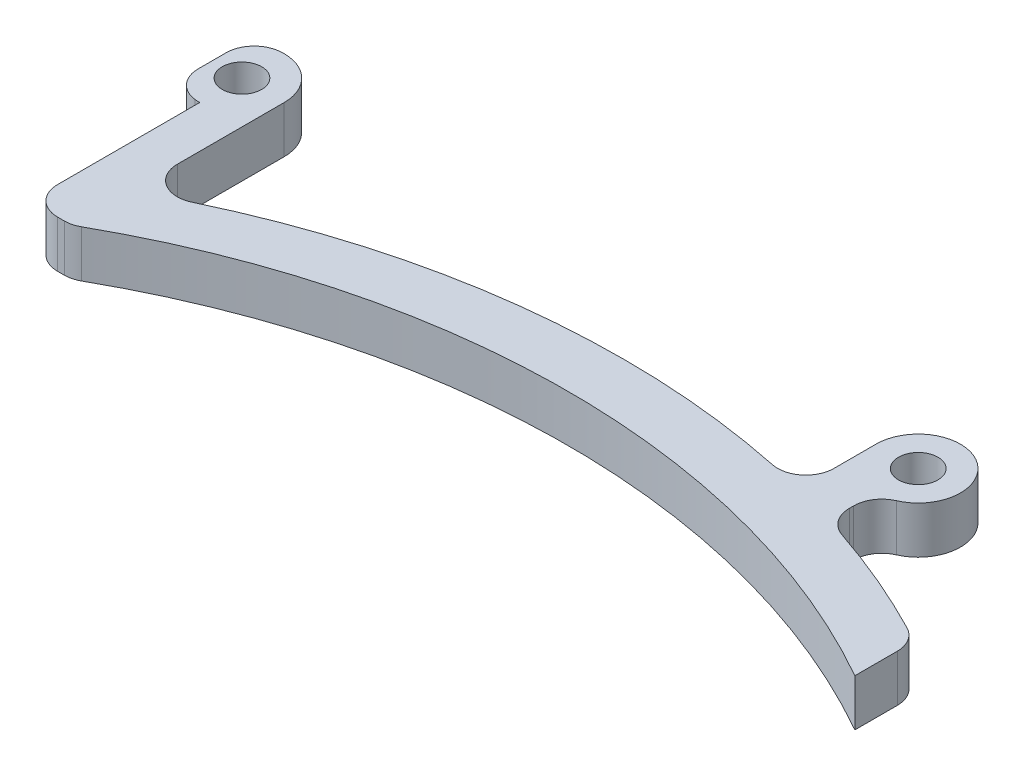
ISO-10303-21;
HEADER;
FILE_DESCRIPTION(('STEP AP214'),'2;1');
FILE_NAME('part.step','',(''),(''),'','','');
FILE_SCHEMA(('AUTOMOTIVE_DESIGN { 1 0 10303 214 1 1 1 1 }'));
ENDSEC;
DATA;
#1=APPLICATION_CONTEXT('core data for automotive mechanical design processes');
#2=APPLICATION_PROTOCOL_DEFINITION('international standard','automotive_design',2000,#1);
#3=PRODUCT_CONTEXT('',#1,'mechanical');
#4=PRODUCT('Part','Part','',(#3));
#5=PRODUCT_RELATED_PRODUCT_CATEGORY('part','',(#4));
#6=PRODUCT_DEFINITION_FORMATION('','',#4);
#7=PRODUCT_DEFINITION_CONTEXT('part definition',#1,'design');
#8=PRODUCT_DEFINITION('design','',#6,#7);
#9=PRODUCT_DEFINITION_SHAPE('','',#8);
#10=(LENGTH_UNIT() NAMED_UNIT(*) SI_UNIT(.MILLI.,.METRE.));
#11=(NAMED_UNIT(*) PLANE_ANGLE_UNIT() SI_UNIT($,.RADIAN.));
#12=(NAMED_UNIT(*) SI_UNIT($,.STERADIAN.) SOLID_ANGLE_UNIT());
#13=UNCERTAINTY_MEASURE_WITH_UNIT(LENGTH_MEASURE(1.E-05),#10,'distance_accuracy_value','');
#14=(GEOMETRIC_REPRESENTATION_CONTEXT(3) GLOBAL_UNCERTAINTY_ASSIGNED_CONTEXT((#13)) GLOBAL_UNIT_ASSIGNED_CONTEXT((#10,
#11,#12)) REPRESENTATION_CONTEXT('',''));
#15=CARTESIAN_POINT('',(0.,0.,0.));
#16=DIRECTION('',(0.,0.,1.));
#17=DIRECTION('',(1.,0.,0.));
#18=AXIS2_PLACEMENT_3D('',#15,#16,#17);
#19=CARTESIAN_POINT('',(0.,5.,0.));
#20=DIRECTION('',(0.,1.,0.));
#21=DIRECTION('',(0.,0.,1.));
#22=AXIS2_PLACEMENT_3D('',#19,#20,#21);
#23=PLANE('',#22);
#24=CARTESIAN_POINT('',(0.,5.,0.));
#25=DIRECTION('',(0.,1.,0.));
#26=DIRECTION('',(0.,0.,1.));
#27=AXIS2_PLACEMENT_3D('',#24,#25,#26);
#28=CIRCLE('',#27,2.1);
#29=CARTESIAN_POINT('',(0.,5.,2.1));
#30=VERTEX_POINT('',#29);
#31=EDGE_CURVE('E323',#30,#30,#28,.T.);
#32=ORIENTED_EDGE('',*,*,#31,.F.);
#33=EDGE_LOOP('',(#32));
#34=FACE_BOUND('',#33,.T.);
#35=CARTESIAN_POINT('',(0.,5.,0.));
#36=DIRECTION('',(0.,1.,0.));
#37=DIRECTION('',(0.,0.,1.));
#38=AXIS2_PLACEMENT_3D('',#35,#36,#37);
#39=CIRCLE('',#38,4.5);
#40=CARTESIAN_POINT('',(4.5,5.,0.));
#41=VERTEX_POINT('',#40);
#42=CARTESIAN_POINT('',(-0.54594154601839,5.,-4.46676032806004));
#43=VERTEX_POINT('',#42);
#44=EDGE_CURVE('E311',#41,#43,#39,.T.);
#45=ORIENTED_EDGE('',*,*,#44,.T.);
#46=CARTESIAN_POINT('',(-0.181980515339463,5.,-1.48892010935335));
#47=DIRECTION('',(0.,1.,0.));
#48=DIRECTION('',(0.,0.,1.));
#49=AXIS2_PLACEMENT_3D('',#46,#47,#48);
#50=CIRCLE('',#49,3.);
#51=CARTESIAN_POINT('',(-3.18198051533946,5.,-1.48892010935335));
#52=VERTEX_POINT('',#51);
#53=EDGE_CURVE('E240',#43,#52,#50,.T.);
#54=ORIENTED_EDGE('',*,*,#53,.T.);
#55=DIRECTION('',(0.,0.,1.));
#56=VECTOR('',#55,1.);
#57=CARTESIAN_POINT('',(-3.18198051533946,5.,3.18198051533946));
#58=LINE('',#57,#56);
#59=CARTESIAN_POINT('',(-3.18198051533946,5.,1.48892010935335));
#60=VERTEX_POINT('',#59);
#61=EDGE_CURVE('E314',#52,#60,#58,.T.);
#62=ORIENTED_EDGE('',*,*,#61,.T.);
#63=CARTESIAN_POINT('',(-0.181980515339463,5.,1.48892010935335));
#64=DIRECTION('',(0.,1.,0.));
#65=DIRECTION('',(0.,0.,1.));
#66=AXIS2_PLACEMENT_3D('',#63,#64,#65);
#67=CIRCLE('',#66,3.);
#68=CARTESIAN_POINT('',(-0.54594154601839,5.,4.46676032806004));
#69=VERTEX_POINT('',#68);
#70=EDGE_CURVE('E189',#60,#69,#67,.T.);
#71=ORIENTED_EDGE('',*,*,#70,.T.);
#72=CARTESIAN_POINT('',(0.,5.,0.));
#73=DIRECTION('',(0.,1.,0.));
#74=DIRECTION('',(0.,0.,1.));
#75=AXIS2_PLACEMENT_3D('',#72,#73,#74);
#76=CIRCLE('',#75,4.5);
#77=CARTESIAN_POINT('',(0.,5.,4.5));
#78=VERTEX_POINT('',#77);
#79=EDGE_CURVE('E181',#69,#78,#76,.T.);
#80=ORIENTED_EDGE('',*,*,#79,.T.);
#81=DIRECTION('',(0.,0.,1.));
#82=VECTOR('',#81,1.);
#83=CARTESIAN_POINT('',(0.,5.,22.6291091194863));
#84=LINE('',#83,#82);
#85=CARTESIAN_POINT('',(0.,5.,19.6291091194863));
#86=VERTEX_POINT('',#85);
#87=EDGE_CURVE('E185',#78,#86,#84,.T.);
#88=ORIENTED_EDGE('',*,*,#87,.T.);
#89=CARTESIAN_POINT('',(3.,5.,19.6291091194863));
#90=DIRECTION('',(0.,1.,0.));
#91=DIRECTION('',(0.,0.,1.));
#92=AXIS2_PLACEMENT_3D('',#89,#90,#91);
#93=CIRCLE('',#92,3.);
#94=CARTESIAN_POINT('',(3.,5.,22.6291091194863));
#95=VERTEX_POINT('',#94);
#96=EDGE_CURVE('E236',#86,#95,#93,.T.);
#97=ORIENTED_EDGE('',*,*,#96,.T.);
#98=DIRECTION('',(1.,0.,0.));
#99=VECTOR('',#98,1.);
#100=CARTESIAN_POINT('',(0.,5.,22.6291091194863));
#101=LINE('',#100,#99);
#102=CARTESIAN_POINT('',(3.70915142787574,5.,22.6291091194863));
#103=VERTEX_POINT('',#102);
#104=EDGE_CURVE('E203',#95,#103,#101,.T.);
#105=ORIENTED_EDGE('',*,*,#104,.T.);
#106=CARTESIAN_POINT('',(3.70915142787574,5.,19.6291091194863));
#107=DIRECTION('',(0.,1.,0.));
#108=DIRECTION('',(0.,0.,1.));
#109=AXIS2_PLACEMENT_3D('',#106,#107,#108);
#110=CIRCLE('',#109,3.);
#111=CARTESIAN_POINT('',(5.17609007882601,5.,22.2459948629509));
#112=VERTEX_POINT('',#111);
#113=EDGE_CURVE('E234',#103,#112,#110,.T.);
#114=ORIENTED_EDGE('',*,*,#113,.T.);
#115=CARTESIAN_POINT('',(46.25,5.,95.5181315207732));
#116=DIRECTION('',(0.,-1.,0.));
#117=DIRECTION('',(0.,0.,-1.));
#118=AXIS2_PLACEMENT_3D('',#115,#116,#117);
#119=CIRCLE('',#118,83.9992386073547);
#120=CARTESIAN_POINT('',(87.7275267094584,5.,22.4737144536115));
#121=VERTEX_POINT('',#120);
#122=EDGE_CURVE('E375',#112,#121,#119,.T.);
#123=ORIENTED_EDGE('',*,*,#122,.T.);
#124=DIRECTION('',(0.,0.,-1.));
#125=VECTOR('',#124,1.);
#126=CARTESIAN_POINT('',(87.7275267094584,5.,16.1522505392229));
#127=LINE('',#126,#125);
#128=CARTESIAN_POINT('',(87.7275267094584,5.,17.9560889558364));
#129=VERTEX_POINT('',#128);
#130=EDGE_CURVE('E372',#121,#129,#127,.T.);
#131=ORIENTED_EDGE('',*,*,#130,.T.);
#132=CARTESIAN_POINT('',(84.7275267094584,5.,17.9560889558364));
#133=DIRECTION('',(0.,1.,0.));
#134=DIRECTION('',(0.,0.,1.));
#135=AXIS2_PLACEMENT_3D('',#132,#133,#134);
#136=CIRCLE('',#135,3.);
#137=CARTESIAN_POINT('',(86.1059443856065,5.,15.2915130589848));
#138=VERTEX_POINT('',#137);
#139=EDGE_CURVE('E238',#129,#138,#136,.T.);
#140=ORIENTED_EDGE('',*,*,#139,.T.);
#141=CARTESIAN_POINT('',(46.25,5.,92.3357867895067));
#142=DIRECTION('',(0.,1.,0.));
#143=DIRECTION('',(0.,0.,-1.));
#144=AXIS2_PLACEMENT_3D('',#141,#142,#143);
#145=CIRCLE('',#144,86.7428176711602);
#146=CARTESIAN_POINT('',(74.0389203031708,5.,10.1646706603207));
#147=VERTEX_POINT('',#146);
#148=EDGE_CURVE('E369',#138,#147,#145,.T.);
#149=ORIENTED_EDGE('',*,*,#148,.T.);
#150=CARTESIAN_POINT('',(75.,5.,7.32278293974789));
#151=DIRECTION('',(0.,1.,0.));
#152=DIRECTION('',(0.,0.,1.));
#153=AXIS2_PLACEMENT_3D('',#150,#151,#152);
#154=CIRCLE('',#153,3.);
#155=CARTESIAN_POINT('',(72.,5.,7.32278293974789));
#156=VERTEX_POINT('',#155);
#157=EDGE_CURVE('E287',#147,#156,#154,.F.);
#158=ORIENTED_EDGE('',*,*,#157,.T.);
#159=DIRECTION('',(0.,0.,-1.));
#160=VECTOR('',#159,1.);
#161=CARTESIAN_POINT('',(72.,5.,9.50310050243676));
#162=LINE('',#161,#160);
#163=CARTESIAN_POINT('',(72.,5.,6.87386354243376));
#164=VERTEX_POINT('',#163);
#165=EDGE_CURVE('E364',#156,#164,#162,.T.);
#166=ORIENTED_EDGE('',*,*,#165,.T.);
#167=CARTESIAN_POINT('',(75.,5.,6.87386354243376));
#168=DIRECTION('',(0.,1.,0.));
#169=DIRECTION('',(0.,0.,1.));
#170=AXIS2_PLACEMENT_3D('',#167,#168,#169);
#171=CIRCLE('',#170,3.);
#172=CARTESIAN_POINT('',(73.8,5.,4.12431812546026));
#173=VERTEX_POINT('',#172);
#174=EDGE_CURVE('E283',#164,#173,#171,.F.);
#175=ORIENTED_EDGE('',*,*,#174,.T.);
#176=CARTESIAN_POINT('',(72.,5.,0.));
#177=DIRECTION('',(0.,1.,0.));
#178=DIRECTION('',(0.,0.,1.));
#179=AXIS2_PLACEMENT_3D('',#176,#177,#178);
#180=CIRCLE('',#179,4.5);
#181=CARTESIAN_POINT('',(67.5,5.,0.));
#182=VERTEX_POINT('',#181);
#183=EDGE_CURVE('E363',#173,#182,#180,.T.);
#184=ORIENTED_EDGE('',*,*,#183,.T.);
#185=DIRECTION('',(0.,0.,1.));
#186=VECTOR('',#185,1.);
#187=CARTESIAN_POINT('',(67.5,5.,0.));
#188=LINE('',#187,#186);
#189=CARTESIAN_POINT('',(67.5,5.,4.46821129342791));
#190=VERTEX_POINT('',#189);
#191=EDGE_CURVE('E316',#182,#190,#188,.T.);
#192=ORIENTED_EDGE('',*,*,#191,.T.);
#193=CARTESIAN_POINT('',(64.5,5.,4.46821129342791));
#194=DIRECTION('',(0.,1.,0.));
#195=DIRECTION('',(0.,0.,1.));
#196=AXIS2_PLACEMENT_3D('',#193,#194,#195);
#197=CIRCLE('',#196,3.);
#198=CARTESIAN_POINT('',(63.8899233228823,5.,7.40552408712848));
#199=VERTEX_POINT('',#198);
#200=EDGE_CURVE('E279',#190,#199,#197,.F.);
#201=ORIENTED_EDGE('',*,*,#200,.T.);
#202=CARTESIAN_POINT('',(46.25,5.,92.3357867895067));
#203=DIRECTION('',(0.,1.,0.));
#204=DIRECTION('',(0.,0.,-1.));
#205=AXIS2_PLACEMENT_3D('',#202,#203,#204);
#206=CIRCLE('',#205,86.7428176711602);
#207=CARTESIAN_POINT('',(8.79536828703072,5.,14.0959824647387));
#208=VERTEX_POINT('',#207);
#209=EDGE_CURVE('E312',#199,#208,#206,.T.);
#210=ORIENTED_EDGE('',*,*,#209,.T.);
#211=CARTESIAN_POINT('',(7.5,5.,11.3900591470974));
#212=DIRECTION('',(0.,1.,0.));
#213=DIRECTION('',(0.,0.,1.));
#214=AXIS2_PLACEMENT_3D('',#211,#212,#213);
#215=CIRCLE('',#214,3.);
#216=CARTESIAN_POINT('',(4.5,5.,11.3900591470974));
#217=VERTEX_POINT('',#216);
#218=EDGE_CURVE('E11',#208,#217,#215,.F.);
#219=ORIENTED_EDGE('',*,*,#218,.T.);
#220=DIRECTION('',(0.,0.,-1.));
#221=VECTOR('',#220,1.);
#222=CARTESIAN_POINT('',(4.5,5.,0.));
#223=LINE('',#222,#221);
#224=EDGE_CURVE('E308',#217,#41,#223,.T.);
#225=ORIENTED_EDGE('',*,*,#224,.T.);
#226=EDGE_LOOP('',(#45,#54,#62,#71,#80,#88,#97,#105,#114,#123,#131,#140,#149,#158,#166,#175,
#184,#192,#201,#210,#219,#225));
#227=FACE_BOUND('',#226,.T.);
#228=CARTESIAN_POINT('',(72.,5.,0.));
#229=DIRECTION('',(0.,1.,0.));
#230=DIRECTION('',(0.,0.,1.));
#231=AXIS2_PLACEMENT_3D('',#228,#229,#230);
#232=CIRCLE('',#231,2.1);
#233=CARTESIAN_POINT('',(72.,5.,2.1));
#234=VERTEX_POINT('',#233);
#235=EDGE_CURVE('E382',#234,#234,#232,.T.);
#236=ORIENTED_EDGE('',*,*,#235,.F.);
#237=EDGE_LOOP('',(#236));
#238=FACE_BOUND('',#237,.T.);
#239=ADVANCED_FACE('F33',(#34,#227,#238),#23,.T.);
#240=CARTESIAN_POINT('',(0.,0.,0.));
#241=DIRECTION('',(0.,1.,0.));
#242=DIRECTION('',(0.,0.,1.));
#243=AXIS2_PLACEMENT_3D('',#240,#241,#242);
#244=PLANE('',#243);
#245=DIRECTION('',(0.,0.,1.));
#246=VECTOR('',#245,1.);
#247=CARTESIAN_POINT('',(-3.18198051533946,0.,3.18198051533946));
#248=LINE('',#247,#246);
#249=CARTESIAN_POINT('',(-3.18198051533946,0.,-1.48892010935335));
#250=VERTEX_POINT('',#249);
#251=CARTESIAN_POINT('',(-3.18198051533946,0.,1.48892010935335));
#252=VERTEX_POINT('',#251);
#253=EDGE_CURVE('E194',#250,#252,#248,.T.);
#254=ORIENTED_EDGE('',*,*,#253,.F.);
#255=CARTESIAN_POINT('',(-0.181980515339463,0.,-1.48892010935335));
#256=DIRECTION('',(0.,1.,0.));
#257=DIRECTION('',(0.,0.,1.));
#258=AXIS2_PLACEMENT_3D('',#255,#256,#257);
#259=CIRCLE('',#258,3.);
#260=CARTESIAN_POINT('',(-0.54594154601839,0.,-4.46676032806004));
#261=VERTEX_POINT('',#260);
#262=EDGE_CURVE('E229',#250,#261,#259,.F.);
#263=ORIENTED_EDGE('',*,*,#262,.T.);
#264=CARTESIAN_POINT('',(0.,0.,0.));
#265=DIRECTION('',(0.,1.,0.));
#266=DIRECTION('',(0.,0.,1.));
#267=AXIS2_PLACEMENT_3D('',#264,#265,#266);
#268=CIRCLE('',#267,4.5);
#269=CARTESIAN_POINT('',(4.5,0.,0.));
#270=VERTEX_POINT('',#269);
#271=EDGE_CURVE('E344',#270,#261,#268,.T.);
#272=ORIENTED_EDGE('',*,*,#271,.F.);
#273=DIRECTION('',(0.,0.,-1.));
#274=VECTOR('',#273,1.);
#275=CARTESIAN_POINT('',(4.5,0.,0.));
#276=LINE('',#275,#274);
#277=CARTESIAN_POINT('',(4.5,0.,11.3900591470974));
#278=VERTEX_POINT('',#277);
#279=EDGE_CURVE('E296',#278,#270,#276,.T.);
#280=ORIENTED_EDGE('',*,*,#279,.F.);
#281=CARTESIAN_POINT('',(7.5,0.,11.3900591470974));
#282=DIRECTION('',(0.,1.,0.));
#283=DIRECTION('',(0.,0.,1.));
#284=AXIS2_PLACEMENT_3D('',#281,#282,#283);
#285=CIRCLE('',#284,3.);
#286=CARTESIAN_POINT('',(8.79536828703072,0.,14.0959824647387));
#287=VERTEX_POINT('',#286);
#288=EDGE_CURVE('E41',#278,#287,#285,.T.);
#289=ORIENTED_EDGE('',*,*,#288,.T.);
#290=CARTESIAN_POINT('',(46.25,0.,92.3357867895067));
#291=DIRECTION('',(0.,1.,0.));
#292=DIRECTION('',(0.,0.,-1.));
#293=AXIS2_PLACEMENT_3D('',#290,#291,#292);
#294=CIRCLE('',#293,86.7428176711602);
#295=CARTESIAN_POINT('',(63.8899233228823,0.,7.40552408712848));
#296=VERTEX_POINT('',#295);
#297=EDGE_CURVE('E294',#296,#287,#294,.T.);
#298=ORIENTED_EDGE('',*,*,#297,.F.);
#299=CARTESIAN_POINT('',(64.5,0.,4.46821129342791));
#300=DIRECTION('',(0.,1.,0.));
#301=DIRECTION('',(0.,0.,1.));
#302=AXIS2_PLACEMENT_3D('',#299,#300,#301);
#303=CIRCLE('',#302,3.);
#304=CARTESIAN_POINT('',(67.5,0.,4.46821129342791));
#305=VERTEX_POINT('',#304);
#306=EDGE_CURVE('E277',#296,#305,#303,.T.);
#307=ORIENTED_EDGE('',*,*,#306,.T.);
#308=DIRECTION('',(0.,0.,1.));
#309=VECTOR('',#308,1.);
#310=CARTESIAN_POINT('',(67.5,0.,0.));
#311=LINE('',#310,#309);
#312=CARTESIAN_POINT('',(67.5,0.,0.));
#313=VERTEX_POINT('',#312);
#314=EDGE_CURVE('E301',#313,#305,#311,.T.);
#315=ORIENTED_EDGE('',*,*,#314,.F.);
#316=CARTESIAN_POINT('',(72.,0.,0.));
#317=DIRECTION('',(0.,1.,0.));
#318=DIRECTION('',(0.,0.,1.));
#319=AXIS2_PLACEMENT_3D('',#316,#317,#318);
#320=CIRCLE('',#319,4.5);
#321=CARTESIAN_POINT('',(73.8,0.,4.12431812546026));
#322=VERTEX_POINT('',#321);
#323=EDGE_CURVE('E339',#322,#313,#320,.T.);
#324=ORIENTED_EDGE('',*,*,#323,.F.);
#325=CARTESIAN_POINT('',(75.,0.,6.87386354243376));
#326=DIRECTION('',(0.,1.,0.));
#327=DIRECTION('',(0.,0.,1.));
#328=AXIS2_PLACEMENT_3D('',#325,#326,#327);
#329=CIRCLE('',#328,3.);
#330=CARTESIAN_POINT('',(72.,0.,6.87386354243376));
#331=VERTEX_POINT('',#330);
#332=EDGE_CURVE('E281',#322,#331,#329,.T.);
#333=ORIENTED_EDGE('',*,*,#332,.T.);
#334=DIRECTION('',(0.,0.,-1.));
#335=VECTOR('',#334,1.);
#336=CARTESIAN_POINT('',(72.,0.,9.50310050243676));
#337=LINE('',#336,#335);
#338=CARTESIAN_POINT('',(72.,0.,7.32278293974789));
#339=VERTEX_POINT('',#338);
#340=EDGE_CURVE('E336',#339,#331,#337,.T.);
#341=ORIENTED_EDGE('',*,*,#340,.F.);
#342=CARTESIAN_POINT('',(75.,0.,7.32278293974789));
#343=DIRECTION('',(0.,1.,0.));
#344=DIRECTION('',(0.,0.,1.));
#345=AXIS2_PLACEMENT_3D('',#342,#343,#344);
#346=CIRCLE('',#345,3.);
#347=CARTESIAN_POINT('',(74.0389203031708,0.,10.1646706603207));
#348=VERTEX_POINT('',#347);
#349=EDGE_CURVE('E285',#339,#348,#346,.T.);
#350=ORIENTED_EDGE('',*,*,#349,.T.);
#351=CARTESIAN_POINT('',(46.25,0.,92.3357867895067));
#352=DIRECTION('',(0.,1.,0.));
#353=DIRECTION('',(0.,0.,-1.));
#354=AXIS2_PLACEMENT_3D('',#351,#352,#353);
#355=CIRCLE('',#354,86.7428176711602);
#356=CARTESIAN_POINT('',(86.1059443856065,0.,15.2915130589848));
#357=VERTEX_POINT('',#356);
#358=EDGE_CURVE('E333',#357,#348,#355,.T.);
#359=ORIENTED_EDGE('',*,*,#358,.F.);
#360=CARTESIAN_POINT('',(84.7275267094584,0.,17.9560889558364));
#361=DIRECTION('',(0.,1.,0.));
#362=DIRECTION('',(0.,0.,1.));
#363=AXIS2_PLACEMENT_3D('',#360,#361,#362);
#364=CIRCLE('',#363,3.);
#365=CARTESIAN_POINT('',(87.7275267094584,0.,17.9560889558364));
#366=VERTEX_POINT('',#365);
#367=EDGE_CURVE('E227',#357,#366,#364,.F.);
#368=ORIENTED_EDGE('',*,*,#367,.T.);
#369=DIRECTION('',(0.,0.,-1.));
#370=VECTOR('',#369,1.);
#371=CARTESIAN_POINT('',(87.7275267094584,0.,16.1522505392229));
#372=LINE('',#371,#370);
#373=CARTESIAN_POINT('',(87.7275267094584,0.,22.4737144536115));
#374=VERTEX_POINT('',#373);
#375=EDGE_CURVE('E330',#374,#366,#372,.T.);
#376=ORIENTED_EDGE('',*,*,#375,.F.);
#377=CARTESIAN_POINT('',(46.25,0.,95.5181315207732));
#378=DIRECTION('',(0.,-1.,0.));
#379=DIRECTION('',(0.,0.,-1.));
#380=AXIS2_PLACEMENT_3D('',#377,#378,#379);
#381=CIRCLE('',#380,83.9992386073547);
#382=CARTESIAN_POINT('',(5.17609007882601,0.,22.2459948629509));
#383=VERTEX_POINT('',#382);
#384=EDGE_CURVE('E328',#383,#374,#381,.T.);
#385=ORIENTED_EDGE('',*,*,#384,.F.);
#386=CARTESIAN_POINT('',(3.70915142787574,0.,19.6291091194863));
#387=DIRECTION('',(0.,1.,0.));
#388=DIRECTION('',(0.,0.,1.));
#389=AXIS2_PLACEMENT_3D('',#386,#387,#388);
#390=CIRCLE('',#389,3.);
#391=CARTESIAN_POINT('',(3.70915142787574,0.,22.6291091194863));
#392=VERTEX_POINT('',#391);
#393=EDGE_CURVE('E223',#383,#392,#390,.F.);
#394=ORIENTED_EDGE('',*,*,#393,.T.);
#395=DIRECTION('',(1.,0.,0.));
#396=VECTOR('',#395,1.);
#397=CARTESIAN_POINT('',(0.,0.,22.6291091194863));
#398=LINE('',#397,#396);
#399=CARTESIAN_POINT('',(3.,0.,22.6291091194863));
#400=VERTEX_POINT('',#399);
#401=EDGE_CURVE('E325',#400,#392,#398,.T.);
#402=ORIENTED_EDGE('',*,*,#401,.F.);
#403=CARTESIAN_POINT('',(3.,0.,19.6291091194863));
#404=DIRECTION('',(0.,1.,0.));
#405=DIRECTION('',(0.,0.,1.));
#406=AXIS2_PLACEMENT_3D('',#403,#404,#405);
#407=CIRCLE('',#406,3.);
#408=CARTESIAN_POINT('',(0.,0.,19.6291091194863));
#409=VERTEX_POINT('',#408);
#410=EDGE_CURVE('E225',#400,#409,#407,.F.);
#411=ORIENTED_EDGE('',*,*,#410,.T.);
#412=DIRECTION('',(0.,0.,1.));
#413=VECTOR('',#412,1.);
#414=CARTESIAN_POINT('',(0.,0.,22.6291091194863));
#415=LINE('',#414,#413);
#416=CARTESIAN_POINT('',(0.,0.,4.5));
#417=VERTEX_POINT('',#416);
#418=EDGE_CURVE('E322',#417,#409,#415,.T.);
#419=ORIENTED_EDGE('',*,*,#418,.F.);
#420=CARTESIAN_POINT('',(0.,0.,0.));
#421=DIRECTION('',(0.,1.,0.));
#422=DIRECTION('',(0.,0.,1.));
#423=AXIS2_PLACEMENT_3D('',#420,#421,#422);
#424=CIRCLE('',#423,4.5);
#425=CARTESIAN_POINT('',(-0.54594154601839,0.,4.46676032806004));
#426=VERTEX_POINT('',#425);
#427=EDGE_CURVE('E207',#426,#417,#424,.T.);
#428=ORIENTED_EDGE('',*,*,#427,.F.);
#429=CARTESIAN_POINT('',(-0.181980515339463,0.,1.48892010935335));
#430=DIRECTION('',(0.,1.,0.));
#431=DIRECTION('',(0.,0.,1.));
#432=AXIS2_PLACEMENT_3D('',#429,#430,#431);
#433=CIRCLE('',#432,3.);
#434=EDGE_CURVE('E221',#426,#252,#433,.F.);
#435=ORIENTED_EDGE('',*,*,#434,.T.);
#436=EDGE_LOOP('',(#254,#263,#272,#280,#289,#298,#307,#315,#324,#333,#341,#350,#359,#368,#376,
#385,#394,#402,#411,#419,#428,#435));
#437=FACE_BOUND('',#436,.T.);
#438=CARTESIAN_POINT('',(0.,0.,0.));
#439=DIRECTION('',(0.,1.,0.));
#440=DIRECTION('',(0.,0.,1.));
#441=AXIS2_PLACEMENT_3D('',#438,#439,#440);
#442=CIRCLE('',#441,2.1);
#443=CARTESIAN_POINT('',(0.,0.,2.1));
#444=VERTEX_POINT('',#443);
#445=EDGE_CURVE('E379',#444,#444,#442,.T.);
#446=ORIENTED_EDGE('',*,*,#445,.T.);
#447=EDGE_LOOP('',(#446));
#448=FACE_BOUND('',#447,.T.);
#449=CARTESIAN_POINT('',(72.,0.,0.));
#450=DIRECTION('',(0.,1.,0.));
#451=DIRECTION('',(0.,0.,1.));
#452=AXIS2_PLACEMENT_3D('',#449,#450,#451);
#453=CIRCLE('',#452,2.1);
#454=CARTESIAN_POINT('',(72.,0.,2.1));
#455=VERTEX_POINT('',#454);
#456=EDGE_CURVE('E385',#455,#455,#453,.T.);
#457=ORIENTED_EDGE('',*,*,#456,.T.);
#458=EDGE_LOOP('',(#457));
#459=FACE_BOUND('',#458,.T.);
#460=ADVANCED_FACE('F292',(#437,#448,#459),#244,.F.);
#461=CARTESIAN_POINT('',(0.,5.,0.));
#462=DIRECTION('',(0.,-1.,0.));
#463=DIRECTION('',(0.,0.,-1.));
#464=AXIS2_PLACEMENT_3D('',#461,#462,#463);
#465=CYLINDRICAL_SURFACE('',#464,4.5);
#466=ORIENTED_EDGE('',*,*,#79,.F.);
#467=DIRECTION('',(0.,-1.,0.));
#468=VECTOR('',#467,1.);
#469=CARTESIAN_POINT('',(-0.54594154601839,5.,4.46676032806004));
#470=LINE('',#469,#468);
#471=EDGE_CURVE('E275',#69,#426,#470,.T.);
#472=ORIENTED_EDGE('',*,*,#471,.T.);
#473=ORIENTED_EDGE('',*,*,#427,.T.);
#474=DIRECTION('',(0.,-1.,0.));
#475=VECTOR('',#474,1.);
#476=CARTESIAN_POINT('',(0.,5.,4.5));
#477=LINE('',#476,#475);
#478=EDGE_CURVE('E200',#78,#417,#477,.T.);
#479=ORIENTED_EDGE('',*,*,#478,.F.);
#480=EDGE_LOOP('',(#466,#472,#473,#479));
#481=FACE_BOUND('',#480,.T.);
#482=ADVANCED_FACE('F205',(#481),#465,.T.);
#483=CARTESIAN_POINT('',(0.,5.,22.6291091194863));
#484=DIRECTION('',(1.,0.,0.));
#485=DIRECTION('',(0.,0.,-1.));
#486=AXIS2_PLACEMENT_3D('',#483,#484,#485);
#487=PLANE('',#486);
#488=ORIENTED_EDGE('',*,*,#418,.T.);
#489=DIRECTION('',(0.,-1.,0.));
#490=VECTOR('',#489,1.);
#491=CARTESIAN_POINT('',(0.,5.,19.6291091194863));
#492=LINE('',#491,#490);
#493=EDGE_CURVE('E202',#409,#86,#492,.F.);
#494=ORIENTED_EDGE('',*,*,#493,.T.);
#495=ORIENTED_EDGE('',*,*,#87,.F.);
#496=ORIENTED_EDGE('',*,*,#478,.T.);
#497=EDGE_LOOP('',(#488,#494,#495,#496));
#498=FACE_BOUND('',#497,.T.);
#499=ADVANCED_FACE('F199',(#498),#487,.F.);
#500=CARTESIAN_POINT('',(0.,5.,22.6291091194863));
#501=DIRECTION('',(0.,0.,-1.));
#502=DIRECTION('',(-1.,0.,0.));
#503=AXIS2_PLACEMENT_3D('',#500,#501,#502);
#504=PLANE('',#503);
#505=ORIENTED_EDGE('',*,*,#104,.F.);
#506=DIRECTION('',(0.,-1.,0.));
#507=VECTOR('',#506,1.);
#508=CARTESIAN_POINT('',(3.,5.,22.6291091194863));
#509=LINE('',#508,#507);
#510=EDGE_CURVE('E265',#95,#400,#509,.T.);
#511=ORIENTED_EDGE('',*,*,#510,.T.);
#512=ORIENTED_EDGE('',*,*,#401,.T.);
#513=DIRECTION('',(0.,-1.,0.));
#514=VECTOR('',#513,1.);
#515=CARTESIAN_POINT('',(3.70915142787574,5.,22.6291091194863));
#516=LINE('',#515,#514);
#517=EDGE_CURVE('E263',#392,#103,#516,.F.);
#518=ORIENTED_EDGE('',*,*,#517,.T.);
#519=EDGE_LOOP('',(#505,#511,#512,#518));
#520=FACE_BOUND('',#519,.T.);
#521=ADVANCED_FACE('F437',(#520),#504,.F.);
#522=CARTESIAN_POINT('',(46.25,5.,95.5181315207732));
#523=DIRECTION('',(0.,-1.,0.));
#524=DIRECTION('',(0.,0.,-1.));
#525=AXIS2_PLACEMENT_3D('',#522,#523,#524);
#526=CYLINDRICAL_SURFACE('',#525,83.9992386073547);
#527=ORIENTED_EDGE('',*,*,#122,.F.);
#528=DIRECTION('',(0.,-1.,0.));
#529=VECTOR('',#528,1.);
#530=CARTESIAN_POINT('',(5.176090078826,5.,22.2459948629509));
#531=LINE('',#530,#529);
#532=EDGE_CURVE('E272',#112,#383,#531,.T.);
#533=ORIENTED_EDGE('',*,*,#532,.T.);
#534=ORIENTED_EDGE('',*,*,#384,.T.);
#535=DIRECTION('',(0.,-1.,0.));
#536=VECTOR('',#535,1.);
#537=CARTESIAN_POINT('',(87.7275267094584,5.,22.4737144536115));
#538=LINE('',#537,#536);
#539=EDGE_CURVE('E210',#121,#374,#538,.T.);
#540=ORIENTED_EDGE('',*,*,#539,.F.);
#541=EDGE_LOOP('',(#527,#533,#534,#540));
#542=FACE_BOUND('',#541,.T.);
#543=ADVANCED_FACE('F433',(#542),#526,.F.);
#544=CARTESIAN_POINT('',(87.7275267094584,5.,16.1522505392229));
#545=DIRECTION('',(-1.,0.,0.));
#546=DIRECTION('',(0.,0.,1.));
#547=AXIS2_PLACEMENT_3D('',#544,#545,#546);
#548=PLANE('',#547);
#549=ORIENTED_EDGE('',*,*,#375,.T.);
#550=DIRECTION('',(0.,-1.,0.));
#551=VECTOR('',#550,1.);
#552=CARTESIAN_POINT('',(87.7275267094584,5.,17.9560889558364));
#553=LINE('',#552,#551);
#554=EDGE_CURVE('E261',#366,#129,#553,.F.);
#555=ORIENTED_EDGE('',*,*,#554,.T.);
#556=ORIENTED_EDGE('',*,*,#130,.F.);
#557=ORIENTED_EDGE('',*,*,#539,.T.);
#558=EDGE_LOOP('',(#549,#555,#556,#557));
#559=FACE_BOUND('',#558,.T.);
#560=ADVANCED_FACE('F429',(#559),#548,.F.);
#561=CARTESIAN_POINT('',(46.25,5.,92.3357867895067));
#562=DIRECTION('',(0.,-1.,0.));
#563=DIRECTION('',(0.,0.,-1.));
#564=AXIS2_PLACEMENT_3D('',#561,#562,#563);
#565=CYLINDRICAL_SURFACE('',#564,86.7428176711602);
#566=ORIENTED_EDGE('',*,*,#358,.T.);
#567=DIRECTION('',(0.,-1.,0.));
#568=VECTOR('',#567,1.);
#569=CARTESIAN_POINT('',(74.0389203031708,5.,10.1646706603207));
#570=LINE('',#569,#568);
#571=EDGE_CURVE('E259',#348,#147,#570,.F.);
#572=ORIENTED_EDGE('',*,*,#571,.T.);
#573=ORIENTED_EDGE('',*,*,#148,.F.);
#574=DIRECTION('',(0.,-1.,0.));
#575=VECTOR('',#574,1.);
#576=CARTESIAN_POINT('',(86.1059443856065,5.,15.2915130589848));
#577=LINE('',#576,#575);
#578=EDGE_CURVE('E256',#138,#357,#577,.T.);
#579=ORIENTED_EDGE('',*,*,#578,.T.);
#580=EDGE_LOOP('',(#566,#572,#573,#579));
#581=FACE_BOUND('',#580,.T.);
#582=ADVANCED_FACE('F425',(#581),#565,.T.);
#583=CARTESIAN_POINT('',(72.,5.,9.50310050243676));
#584=DIRECTION('',(-1.,0.,0.));
#585=DIRECTION('',(0.,0.,1.));
#586=AXIS2_PLACEMENT_3D('',#583,#584,#585);
#587=PLANE('',#586);
#588=ORIENTED_EDGE('',*,*,#340,.T.);
#589=DIRECTION('',(0.,1.,0.));
#590=VECTOR('',#589,1.);
#591=CARTESIAN_POINT('',(72.,5.,6.87386354243376));
#592=LINE('',#591,#590);
#593=EDGE_CURVE('E254',#331,#164,#592,.T.);
#594=ORIENTED_EDGE('',*,*,#593,.T.);
#595=ORIENTED_EDGE('',*,*,#165,.F.);
#596=DIRECTION('',(0.,1.,0.));
#597=VECTOR('',#596,1.);
#598=CARTESIAN_POINT('',(72.,0.,7.32278293974789));
#599=LINE('',#598,#597);
#600=EDGE_CURVE('E251',#156,#339,#599,.F.);
#601=ORIENTED_EDGE('',*,*,#600,.T.);
#602=EDGE_LOOP('',(#588,#594,#595,#601));
#603=FACE_BOUND('',#602,.T.);
#604=ADVANCED_FACE('F422',(#603),#587,.F.);
#605=CARTESIAN_POINT('',(72.,5.,0.));
#606=DIRECTION('',(0.,-1.,0.));
#607=DIRECTION('',(0.,0.,-1.));
#608=AXIS2_PLACEMENT_3D('',#605,#606,#607);
#609=CYLINDRICAL_SURFACE('',#608,4.5);
#610=ORIENTED_EDGE('',*,*,#183,.F.);
#611=DIRECTION('',(0.,-1.,0.));
#612=VECTOR('',#611,1.);
#613=CARTESIAN_POINT('',(73.8,5.,4.12431812546026));
#614=LINE('',#613,#612);
#615=EDGE_CURVE('E248',#173,#322,#614,.T.);
#616=ORIENTED_EDGE('',*,*,#615,.T.);
#617=ORIENTED_EDGE('',*,*,#323,.T.);
#618=DIRECTION('',(0.,-1.,0.));
#619=VECTOR('',#618,1.);
#620=CARTESIAN_POINT('',(67.5,5.,0.));
#621=LINE('',#620,#619);
#622=EDGE_CURVE('E215',#182,#313,#621,.T.);
#623=ORIENTED_EDGE('',*,*,#622,.F.);
#624=EDGE_LOOP('',(#610,#616,#617,#623));
#625=FACE_BOUND('',#624,.T.);
#626=ADVANCED_FACE('F419',(#625),#609,.T.);
#627=CARTESIAN_POINT('',(67.5,5.,0.));
#628=DIRECTION('',(1.,0.,0.));
#629=DIRECTION('',(0.,0.,-1.));
#630=AXIS2_PLACEMENT_3D('',#627,#628,#629);
#631=PLANE('',#630);
#632=ORIENTED_EDGE('',*,*,#314,.T.);
#633=DIRECTION('',(0.,1.,0.));
#634=VECTOR('',#633,1.);
#635=CARTESIAN_POINT('',(67.5,5.,4.46821129342791));
#636=LINE('',#635,#634);
#637=EDGE_CURVE('E246',#305,#190,#636,.T.);
#638=ORIENTED_EDGE('',*,*,#637,.T.);
#639=ORIENTED_EDGE('',*,*,#191,.F.);
#640=ORIENTED_EDGE('',*,*,#622,.T.);
#641=EDGE_LOOP('',(#632,#638,#639,#640));
#642=FACE_BOUND('',#641,.T.);
#643=ADVANCED_FACE('F354',(#642),#631,.F.);
#644=CARTESIAN_POINT('',(46.25,5.,92.3357867895067));
#645=DIRECTION('',(0.,-1.,0.));
#646=DIRECTION('',(0.,0.,-1.));
#647=AXIS2_PLACEMENT_3D('',#644,#645,#646);
#648=CYLINDRICAL_SURFACE('',#647,86.7428176711602);
#649=ORIENTED_EDGE('',*,*,#209,.F.);
#650=DIRECTION('',(0.,-1.,0.));
#651=VECTOR('',#650,1.);
#652=CARTESIAN_POINT('',(63.8899233228823,5.,7.40552408712847));
#653=LINE('',#652,#651);
#654=EDGE_CURVE('E243',#199,#296,#653,.T.);
#655=ORIENTED_EDGE('',*,*,#654,.T.);
#656=ORIENTED_EDGE('',*,*,#297,.T.);
#657=DIRECTION('',(0.,-1.,0.));
#658=VECTOR('',#657,1.);
#659=CARTESIAN_POINT('',(8.79536828703072,5.,14.0959824647387));
#660=LINE('',#659,#658);
#661=EDGE_CURVE('E54',#287,#208,#660,.F.);
#662=ORIENTED_EDGE('',*,*,#661,.T.);
#663=EDGE_LOOP('',(#649,#655,#656,#662));
#664=FACE_BOUND('',#663,.T.);
#665=ADVANCED_FACE('F299',(#664),#648,.T.);
#666=CARTESIAN_POINT('',(4.5,5.,0.));
#667=DIRECTION('',(-1.,0.,0.));
#668=DIRECTION('',(0.,0.,1.));
#669=AXIS2_PLACEMENT_3D('',#666,#667,#668);
#670=PLANE('',#669);
#671=ORIENTED_EDGE('',*,*,#224,.F.);
#672=DIRECTION('',(0.,1.,0.));
#673=VECTOR('',#672,1.);
#674=CARTESIAN_POINT('',(4.5,0.,11.3900591470974));
#675=LINE('',#674,#673);
#676=EDGE_CURVE('E269',#217,#278,#675,.F.);
#677=ORIENTED_EDGE('',*,*,#676,.T.);
#678=ORIENTED_EDGE('',*,*,#279,.T.);
#679=DIRECTION('',(0.,-1.,0.));
#680=VECTOR('',#679,1.);
#681=CARTESIAN_POINT('',(4.5,5.,0.));
#682=LINE('',#681,#680);
#683=EDGE_CURVE('E309',#41,#270,#682,.T.);
#684=ORIENTED_EDGE('',*,*,#683,.F.);
#685=EDGE_LOOP('',(#671,#677,#678,#684));
#686=FACE_BOUND('',#685,.T.);
#687=ADVANCED_FACE('F305',(#686),#670,.F.);
#688=CARTESIAN_POINT('',(0.,5.,0.));
#689=DIRECTION('',(0.,-1.,0.));
#690=DIRECTION('',(0.,0.,-1.));
#691=AXIS2_PLACEMENT_3D('',#688,#689,#690);
#692=CYLINDRICAL_SURFACE('',#691,4.5);
#693=ORIENTED_EDGE('',*,*,#271,.T.);
#694=DIRECTION('',(0.,-1.,0.));
#695=VECTOR('',#694,1.);
#696=CARTESIAN_POINT('',(-0.54594154601839,5.,-4.46676032806004));
#697=LINE('',#696,#695);
#698=EDGE_CURVE('E231',#261,#43,#697,.F.);
#699=ORIENTED_EDGE('',*,*,#698,.T.);
#700=ORIENTED_EDGE('',*,*,#44,.F.);
#701=ORIENTED_EDGE('',*,*,#683,.T.);
#702=EDGE_LOOP('',(#693,#699,#700,#701));
#703=FACE_BOUND('',#702,.T.);
#704=ADVANCED_FACE('F408',(#703),#692,.T.);
#705=CARTESIAN_POINT('',(-3.18198051533946,5.,3.18198051533946));
#706=DIRECTION('',(1.,0.,0.));
#707=DIRECTION('',(0.,0.,-1.));
#708=AXIS2_PLACEMENT_3D('',#705,#706,#707);
#709=PLANE('',#708);
#710=ORIENTED_EDGE('',*,*,#61,.F.);
#711=DIRECTION('',(0.,-1.,0.));
#712=VECTOR('',#711,1.);
#713=CARTESIAN_POINT('',(-3.18198051533946,5.,-1.48892010935335));
#714=LINE('',#713,#712);
#715=EDGE_CURVE('E212',#52,#250,#714,.T.);
#716=ORIENTED_EDGE('',*,*,#715,.T.);
#717=ORIENTED_EDGE('',*,*,#253,.T.);
#718=DIRECTION('',(0.,-1.,0.));
#719=VECTOR('',#718,1.);
#720=CARTESIAN_POINT('',(-3.18198051533946,5.,1.48892010935335));
#721=LINE('',#720,#719);
#722=EDGE_CURVE('E209',#252,#60,#721,.F.);
#723=ORIENTED_EDGE('',*,*,#722,.T.);
#724=EDGE_LOOP('',(#710,#716,#717,#723));
#725=FACE_BOUND('',#724,.T.);
#726=ADVANCED_FACE('F405',(#725),#709,.F.);
#727=CARTESIAN_POINT('',(0.,5.,0.));
#728=DIRECTION('',(0.,-1.,0.));
#729=DIRECTION('',(0.,0.,-1.));
#730=AXIS2_PLACEMENT_3D('',#727,#728,#729);
#731=CYLINDRICAL_SURFACE('',#730,2.1);
#732=ORIENTED_EDGE('',*,*,#31,.T.);
#733=EDGE_LOOP('',(#732));
#734=FACE_BOUND('',#733,.T.);
#735=ORIENTED_EDGE('',*,*,#445,.F.);
#736=EDGE_LOOP('',(#735));
#737=FACE_BOUND('',#736,.T.);
#738=ADVANCED_FACE('F402',(#734,#737),#731,.F.);
#739=CARTESIAN_POINT('',(72.,5.,0.));
#740=DIRECTION('',(0.,-1.,0.));
#741=DIRECTION('',(0.,0.,-1.));
#742=AXIS2_PLACEMENT_3D('',#739,#740,#741);
#743=CYLINDRICAL_SURFACE('',#742,2.1);
#744=ORIENTED_EDGE('',*,*,#235,.T.);
#745=EDGE_LOOP('',(#744));
#746=FACE_BOUND('',#745,.T.);
#747=ORIENTED_EDGE('',*,*,#456,.F.);
#748=EDGE_LOOP('',(#747));
#749=FACE_BOUND('',#748,.T.);
#750=ADVANCED_FACE('F391',(#746,#749),#743,.F.);
#751=CARTESIAN_POINT('',(-0.181980515339463,5.,-1.48892010935335));
#752=DIRECTION('',(0.,-1.,0.));
#753=DIRECTION('',(0.,0.,-1.));
#754=AXIS2_PLACEMENT_3D('',#751,#752,#753);
#755=CYLINDRICAL_SURFACE('',#754,3.);
#756=ORIENTED_EDGE('',*,*,#53,.F.);
#757=ORIENTED_EDGE('',*,*,#698,.F.);
#758=ORIENTED_EDGE('',*,*,#262,.F.);
#759=ORIENTED_EDGE('',*,*,#715,.F.);
#760=EDGE_LOOP('',(#756,#757,#758,#759));
#761=FACE_BOUND('',#760,.T.);
#762=ADVANCED_FACE('F446',(#761),#755,.T.);
#763=CARTESIAN_POINT('',(64.5,5.,4.46821129342791));
#764=DIRECTION('',(0.,-1.,0.));
#765=DIRECTION('',(0.,0.,-1.));
#766=AXIS2_PLACEMENT_3D('',#763,#764,#765);
#767=CYLINDRICAL_SURFACE('',#766,3.);
#768=ORIENTED_EDGE('',*,*,#200,.F.);
#769=ORIENTED_EDGE('',*,*,#637,.F.);
#770=ORIENTED_EDGE('',*,*,#306,.F.);
#771=ORIENTED_EDGE('',*,*,#654,.F.);
#772=EDGE_LOOP('',(#768,#769,#770,#771));
#773=FACE_BOUND('',#772,.T.);
#774=ADVANCED_FACE('F362',(#773),#767,.F.);
#775=CARTESIAN_POINT('',(75.,5.,6.87386354243376));
#776=DIRECTION('',(0.,-1.,0.));
#777=DIRECTION('',(0.,0.,-1.));
#778=AXIS2_PLACEMENT_3D('',#775,#776,#777);
#779=CYLINDRICAL_SURFACE('',#778,3.);
#780=ORIENTED_EDGE('',*,*,#174,.F.);
#781=ORIENTED_EDGE('',*,*,#593,.F.);
#782=ORIENTED_EDGE('',*,*,#332,.F.);
#783=ORIENTED_EDGE('',*,*,#615,.F.);
#784=EDGE_LOOP('',(#780,#781,#782,#783));
#785=FACE_BOUND('',#784,.T.);
#786=ADVANCED_FACE('F452',(#785),#779,.F.);
#787=CARTESIAN_POINT('',(75.,5.,7.32278293974789));
#788=DIRECTION('',(0.,-1.,0.));
#789=DIRECTION('',(0.,0.,-1.));
#790=AXIS2_PLACEMENT_3D('',#787,#788,#789);
#791=CYLINDRICAL_SURFACE('',#790,3.);
#792=ORIENTED_EDGE('',*,*,#157,.F.);
#793=ORIENTED_EDGE('',*,*,#571,.F.);
#794=ORIENTED_EDGE('',*,*,#349,.F.);
#795=ORIENTED_EDGE('',*,*,#600,.F.);
#796=EDGE_LOOP('',(#792,#793,#794,#795));
#797=FACE_BOUND('',#796,.T.);
#798=ADVANCED_FACE('F455',(#797),#791,.F.);
#799=CARTESIAN_POINT('',(84.7275267094584,5.,17.9560889558364));
#800=DIRECTION('',(0.,-1.,0.));
#801=DIRECTION('',(0.,0.,-1.));
#802=AXIS2_PLACEMENT_3D('',#799,#800,#801);
#803=CYLINDRICAL_SURFACE('',#802,3.);
#804=ORIENTED_EDGE('',*,*,#139,.F.);
#805=ORIENTED_EDGE('',*,*,#554,.F.);
#806=ORIENTED_EDGE('',*,*,#367,.F.);
#807=ORIENTED_EDGE('',*,*,#578,.F.);
#808=EDGE_LOOP('',(#804,#805,#806,#807));
#809=FACE_BOUND('',#808,.T.);
#810=ADVANCED_FACE('F459',(#809),#803,.T.);
#811=CARTESIAN_POINT('',(3.,5.,19.6291091194863));
#812=DIRECTION('',(0.,-1.,0.));
#813=DIRECTION('',(0.,0.,-1.));
#814=AXIS2_PLACEMENT_3D('',#811,#812,#813);
#815=CYLINDRICAL_SURFACE('',#814,3.);
#816=ORIENTED_EDGE('',*,*,#96,.F.);
#817=ORIENTED_EDGE('',*,*,#493,.F.);
#818=ORIENTED_EDGE('',*,*,#410,.F.);
#819=ORIENTED_EDGE('',*,*,#510,.F.);
#820=EDGE_LOOP('',(#816,#817,#818,#819));
#821=FACE_BOUND('',#820,.T.);
#822=ADVANCED_FACE('F463',(#821),#815,.T.);
#823=CARTESIAN_POINT('',(7.5,5.,11.3900591470974));
#824=DIRECTION('',(0.,-1.,0.));
#825=DIRECTION('',(0.,0.,-1.));
#826=AXIS2_PLACEMENT_3D('',#823,#824,#825);
#827=CYLINDRICAL_SURFACE('',#826,3.);
#828=ORIENTED_EDGE('',*,*,#218,.F.);
#829=ORIENTED_EDGE('',*,*,#661,.F.);
#830=ORIENTED_EDGE('',*,*,#288,.F.);
#831=ORIENTED_EDGE('',*,*,#676,.F.);
#832=EDGE_LOOP('',(#828,#829,#830,#831));
#833=FACE_BOUND('',#832,.T.);
#834=ADVANCED_FACE('F303',(#833),#827,.F.);
#835=CARTESIAN_POINT('',(3.70915142787574,5.,19.6291091194863));
#836=DIRECTION('',(0.,-1.,0.));
#837=DIRECTION('',(0.,0.,-1.));
#838=AXIS2_PLACEMENT_3D('',#835,#836,#837);
#839=CYLINDRICAL_SURFACE('',#838,3.);
#840=ORIENTED_EDGE('',*,*,#113,.F.);
#841=ORIENTED_EDGE('',*,*,#517,.F.);
#842=ORIENTED_EDGE('',*,*,#393,.F.);
#843=ORIENTED_EDGE('',*,*,#532,.F.);
#844=EDGE_LOOP('',(#840,#841,#842,#843));
#845=FACE_BOUND('',#844,.T.);
#846=ADVANCED_FACE('F469',(#845),#839,.T.);
#847=CARTESIAN_POINT('',(-0.181980515339463,5.,1.48892010935335));
#848=DIRECTION('',(0.,-1.,0.));
#849=DIRECTION('',(0.,0.,-1.));
#850=AXIS2_PLACEMENT_3D('',#847,#848,#849);
#851=CYLINDRICAL_SURFACE('',#850,3.);
#852=ORIENTED_EDGE('',*,*,#70,.F.);
#853=ORIENTED_EDGE('',*,*,#722,.F.);
#854=ORIENTED_EDGE('',*,*,#434,.F.);
#855=ORIENTED_EDGE('',*,*,#471,.F.);
#856=EDGE_LOOP('',(#852,#853,#854,#855));
#857=FACE_BOUND('',#856,.T.);
#858=ADVANCED_FACE('F35',(#857),#851,.T.);
#859=CLOSED_SHELL('',(#239,#460,#482,#499,#521,#543,#560,#582,#604,#626,#643,#665,#687,#704,
#726,#738,#750,#762,#774,#786,#798,#810,#822,#834,#846,#858));
#860=MANIFOLD_SOLID_BREP('B2',#859);
#861=ADVANCED_BREP_SHAPE_REPRESENTATION('',(#18,#860),#14);
#862=SHAPE_DEFINITION_REPRESENTATION(#9,#861);
ENDSEC;
END-ISO-10303-21;
